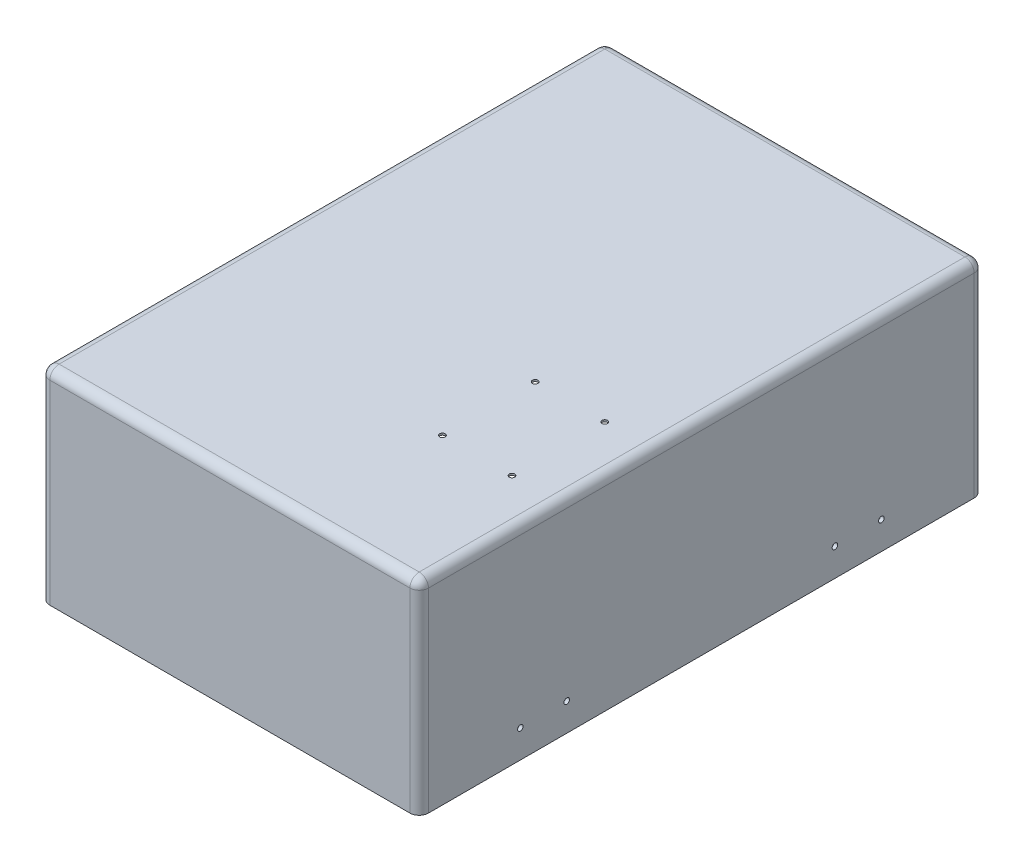
ISO-10303-21;
HEADER;
FILE_DESCRIPTION(('STEP AP214'),'2;1');
FILE_NAME('part.step','',(''),(''),'','','');
FILE_SCHEMA(('AUTOMOTIVE_DESIGN { 1 0 10303 214 1 1 1 1 }'));
ENDSEC;
DATA;
#1=APPLICATION_CONTEXT('core data for automotive mechanical design processes');
#2=APPLICATION_PROTOCOL_DEFINITION('international standard','automotive_design',2000,#1);
#3=PRODUCT_CONTEXT('',#1,'mechanical');
#4=PRODUCT('Part','Part','',(#3));
#5=PRODUCT_RELATED_PRODUCT_CATEGORY('part','',(#4));
#6=PRODUCT_DEFINITION_FORMATION('','',#4);
#7=PRODUCT_DEFINITION_CONTEXT('part definition',#1,'design');
#8=PRODUCT_DEFINITION('design','',#6,#7);
#9=PRODUCT_DEFINITION_SHAPE('','',#8);
#10=(LENGTH_UNIT() NAMED_UNIT(*) SI_UNIT(.MILLI.,.METRE.));
#11=(NAMED_UNIT(*) PLANE_ANGLE_UNIT() SI_UNIT($,.RADIAN.));
#12=(NAMED_UNIT(*) SI_UNIT($,.STERADIAN.) SOLID_ANGLE_UNIT());
#13=UNCERTAINTY_MEASURE_WITH_UNIT(LENGTH_MEASURE(1.E-05),#10,'distance_accuracy_value','');
#14=(GEOMETRIC_REPRESENTATION_CONTEXT(3) GLOBAL_UNCERTAINTY_ASSIGNED_CONTEXT((#13)) GLOBAL_UNIT_ASSIGNED_CONTEXT((#10,
#11,#12)) REPRESENTATION_CONTEXT('',''));
#15=CARTESIAN_POINT('',(0.,0.,0.));
#16=DIRECTION('',(0.,0.,1.));
#17=DIRECTION('',(1.,0.,0.));
#18=AXIS2_PLACEMENT_3D('',#15,#16,#17);
#19=CARTESIAN_POINT('',(189.227831447779,-190.,-144.));
#20=DIRECTION('',(1.,0.,0.));
#21=DIRECTION('',(0.,0.,-1.));
#22=AXIS2_PLACEMENT_3D('',#19,#20,#21);
#23=CYLINDRICAL_SURFACE('',#22,3.);
#24=CARTESIAN_POINT('',(204.,-190.,-144.));
#25=DIRECTION('',(-1.,0.,0.));
#26=DIRECTION('',(0.,-1.,0.));
#27=AXIS2_PLACEMENT_3D('',#24,#25,#26);
#28=CIRCLE('',#27,3.);
#29=CARTESIAN_POINT('',(204.,-193.,-144.));
#30=VERTEX_POINT('',#29);
#31=EDGE_CURVE('E347',#30,#30,#28,.T.);
#32=ORIENTED_EDGE('',*,*,#31,.F.);
#33=EDGE_LOOP('',(#32));
#34=FACE_BOUND('',#33,.T.);
#35=CARTESIAN_POINT('',(200.,-190.,-144.));
#36=DIRECTION('',(1.,0.,0.));
#37=DIRECTION('',(0.,0.,1.));
#38=AXIS2_PLACEMENT_3D('',#35,#36,#37);
#39=CIRCLE('',#38,3.);
#40=CARTESIAN_POINT('',(200.,-190.,-141.));
#41=VERTEX_POINT('',#40);
#42=EDGE_CURVE('E423',#41,#41,#39,.T.);
#43=ORIENTED_EDGE('',*,*,#42,.F.);
#44=EDGE_LOOP('',(#43));
#45=FACE_BOUND('',#44,.T.);
#46=ADVANCED_FACE('F17',(#34,#45),#23,.F.);
#47=CARTESIAN_POINT('',(191.59591611211,-190.,-194.));
#48=DIRECTION('',(1.,0.,0.));
#49=DIRECTION('',(0.,0.,-1.));
#50=AXIS2_PLACEMENT_3D('',#47,#48,#49);
#51=CYLINDRICAL_SURFACE('',#50,3.);
#52=CARTESIAN_POINT('',(204.,-190.,-194.));
#53=DIRECTION('',(-1.,0.,0.));
#54=DIRECTION('',(0.,-1.,0.));
#55=AXIS2_PLACEMENT_3D('',#52,#53,#54);
#56=CIRCLE('',#55,3.);
#57=CARTESIAN_POINT('',(204.,-193.,-194.));
#58=VERTEX_POINT('',#57);
#59=EDGE_CURVE('E352',#58,#58,#56,.T.);
#60=ORIENTED_EDGE('',*,*,#59,.F.);
#61=EDGE_LOOP('',(#60));
#62=FACE_BOUND('',#61,.T.);
#63=CARTESIAN_POINT('',(200.,-190.,-194.));
#64=DIRECTION('',(1.,0.,0.));
#65=DIRECTION('',(0.,0.,1.));
#66=AXIS2_PLACEMENT_3D('',#63,#64,#65);
#67=CIRCLE('',#66,3.);
#68=CARTESIAN_POINT('',(200.,-190.,-191.));
#69=VERTEX_POINT('',#68);
#70=EDGE_CURVE('E419',#69,#69,#67,.T.);
#71=ORIENTED_EDGE('',*,*,#70,.F.);
#72=EDGE_LOOP('',(#71));
#73=FACE_BOUND('',#72,.T.);
#74=ADVANCED_FACE('F651',(#62,#73),#51,.F.);
#75=CARTESIAN_POINT('',(195.513389522599,-190.,145.));
#76=DIRECTION('',(1.,0.,0.));
#77=DIRECTION('',(0.,0.,-1.));
#78=AXIS2_PLACEMENT_3D('',#75,#76,#77);
#79=CYLINDRICAL_SURFACE('',#78,3.);
#80=CARTESIAN_POINT('',(204.,-190.,145.));
#81=DIRECTION('',(-1.,0.,0.));
#82=DIRECTION('',(0.,-1.,0.));
#83=AXIS2_PLACEMENT_3D('',#80,#81,#82);
#84=CIRCLE('',#83,3.);
#85=CARTESIAN_POINT('',(204.,-193.,145.));
#86=VERTEX_POINT('',#85);
#87=EDGE_CURVE('E264',#86,#86,#84,.T.);
#88=ORIENTED_EDGE('',*,*,#87,.F.);
#89=EDGE_LOOP('',(#88));
#90=FACE_BOUND('',#89,.T.);
#91=CARTESIAN_POINT('',(200.,-190.,145.));
#92=DIRECTION('',(1.,0.,0.));
#93=DIRECTION('',(0.,0.,1.));
#94=AXIS2_PLACEMENT_3D('',#91,#92,#93);
#95=CIRCLE('',#94,3.);
#96=CARTESIAN_POINT('',(200.,-190.,148.));
#97=VERTEX_POINT('',#96);
#98=EDGE_CURVE('E422',#97,#97,#95,.T.);
#99=ORIENTED_EDGE('',*,*,#98,.F.);
#100=EDGE_LOOP('',(#99));
#101=FACE_BOUND('',#100,.T.);
#102=ADVANCED_FACE('F656',(#90,#101),#79,.F.);
#103=CARTESIAN_POINT('',(183.680573859258,-190.,195.));
#104=DIRECTION('',(1.,0.,0.));
#105=DIRECTION('',(0.,0.,-1.));
#106=AXIS2_PLACEMENT_3D('',#103,#104,#105);
#107=CYLINDRICAL_SURFACE('',#106,3.);
#108=CARTESIAN_POINT('',(204.,-190.,195.));
#109=DIRECTION('',(-1.,0.,0.));
#110=DIRECTION('',(0.,-1.,0.));
#111=AXIS2_PLACEMENT_3D('',#108,#109,#110);
#112=CIRCLE('',#111,3.);
#113=CARTESIAN_POINT('',(204.,-193.,195.));
#114=VERTEX_POINT('',#113);
#115=EDGE_CURVE('E259',#114,#114,#112,.T.);
#116=ORIENTED_EDGE('',*,*,#115,.F.);
#117=EDGE_LOOP('',(#116));
#118=FACE_BOUND('',#117,.T.);
#119=CARTESIAN_POINT('',(200.,-190.,195.));
#120=DIRECTION('',(1.,0.,0.));
#121=DIRECTION('',(0.,0.,1.));
#122=AXIS2_PLACEMENT_3D('',#119,#120,#121);
#123=CIRCLE('',#122,3.);
#124=CARTESIAN_POINT('',(200.,-190.,198.));
#125=VERTEX_POINT('',#124);
#126=EDGE_CURVE('E436',#125,#125,#123,.T.);
#127=ORIENTED_EDGE('',*,*,#126,.F.);
#128=EDGE_LOOP('',(#127));
#129=FACE_BOUND('',#128,.T.);
#130=ADVANCED_FACE('F691',(#118,#129),#107,.F.);
#131=CARTESIAN_POINT('',(79.,-3.90891219785888,154.));
#132=DIRECTION('',(0.,1.,0.));
#133=DIRECTION('',(0.,0.,1.));
#134=AXIS2_PLACEMENT_3D('',#131,#132,#133);
#135=CYLINDRICAL_SURFACE('',#134,3.);
#136=CARTESIAN_POINT('',(79.,0.,154.));
#137=DIRECTION('',(0.,-1.,0.));
#138=DIRECTION('',(-1.,0.,0.));
#139=AXIS2_PLACEMENT_3D('',#136,#137,#138);
#140=CIRCLE('',#139,3.);
#141=CARTESIAN_POINT('',(76.,0.,154.));
#142=VERTEX_POINT('',#141);
#143=EDGE_CURVE('E608',#142,#142,#140,.T.);
#144=ORIENTED_EDGE('',*,*,#143,.F.);
#145=EDGE_LOOP('',(#144));
#146=FACE_BOUND('',#145,.T.);
#147=CARTESIAN_POINT('',(79.,-2.,154.));
#148=DIRECTION('',(0.,1.,0.));
#149=DIRECTION('',(0.,0.,-1.));
#150=AXIS2_PLACEMENT_3D('',#147,#148,#149);
#151=CIRCLE('',#150,3.);
#152=CARTESIAN_POINT('',(79.,-2.,151.));
#153=VERTEX_POINT('',#152);
#154=EDGE_CURVE('E402',#153,#153,#151,.T.);
#155=ORIENTED_EDGE('',*,*,#154,.F.);
#156=EDGE_LOOP('',(#155));
#157=FACE_BOUND('',#156,.T.);
#158=ADVANCED_FACE('F688',(#146,#157),#135,.F.);
#159=CARTESIAN_POINT('',(154.,-4.68505447703618,154.));
#160=DIRECTION('',(0.,1.,0.));
#161=DIRECTION('',(0.,0.,1.));
#162=AXIS2_PLACEMENT_3D('',#159,#160,#161);
#163=CYLINDRICAL_SURFACE('',#162,3.);
#164=CARTESIAN_POINT('',(154.,0.,154.));
#165=DIRECTION('',(0.,-1.,0.));
#166=DIRECTION('',(-1.,0.,0.));
#167=AXIS2_PLACEMENT_3D('',#164,#165,#166);
#168=CIRCLE('',#167,3.);
#169=CARTESIAN_POINT('',(151.,0.,154.));
#170=VERTEX_POINT('',#169);
#171=EDGE_CURVE('E605',#170,#170,#168,.T.);
#172=ORIENTED_EDGE('',*,*,#171,.F.);
#173=EDGE_LOOP('',(#172));
#174=FACE_BOUND('',#173,.T.);
#175=CARTESIAN_POINT('',(154.,-2.,154.));
#176=DIRECTION('',(0.,1.,0.));
#177=DIRECTION('',(0.,0.,-1.));
#178=AXIS2_PLACEMENT_3D('',#175,#176,#177);
#179=CIRCLE('',#178,3.);
#180=CARTESIAN_POINT('',(154.,-2.,151.));
#181=VERTEX_POINT('',#180);
#182=EDGE_CURVE('E403',#181,#181,#179,.T.);
#183=ORIENTED_EDGE('',*,*,#182,.F.);
#184=EDGE_LOOP('',(#183));
#185=FACE_BOUND('',#184,.T.);
#186=ADVANCED_FACE('F632',(#174,#185),#163,.F.);
#187=CARTESIAN_POINT('',(154.,-4.69000260563148,54.));
#188=DIRECTION('',(0.,1.,0.));
#189=DIRECTION('',(0.,0.,1.));
#190=AXIS2_PLACEMENT_3D('',#187,#188,#189);
#191=CYLINDRICAL_SURFACE('',#190,3.);
#192=CARTESIAN_POINT('',(154.,0.,54.));
#193=DIRECTION('',(0.,-1.,0.));
#194=DIRECTION('',(-1.,0.,0.));
#195=AXIS2_PLACEMENT_3D('',#192,#193,#194);
#196=CIRCLE('',#195,3.);
#197=CARTESIAN_POINT('',(151.,0.,54.));
#198=VERTEX_POINT('',#197);
#199=EDGE_CURVE('E590',#198,#198,#196,.T.);
#200=ORIENTED_EDGE('',*,*,#199,.F.);
#201=EDGE_LOOP('',(#200));
#202=FACE_BOUND('',#201,.T.);
#203=CARTESIAN_POINT('',(154.,-2.,54.));
#204=DIRECTION('',(0.,1.,0.));
#205=DIRECTION('',(0.,0.,-1.));
#206=AXIS2_PLACEMENT_3D('',#203,#204,#205);
#207=CIRCLE('',#206,3.);
#208=CARTESIAN_POINT('',(154.,-2.,51.));
#209=VERTEX_POINT('',#208);
#210=EDGE_CURVE('E181',#209,#209,#207,.T.);
#211=ORIENTED_EDGE('',*,*,#210,.F.);
#212=EDGE_LOOP('',(#211));
#213=FACE_BOUND('',#212,.T.);
#214=ADVANCED_FACE('F628',(#202,#213),#191,.F.);
#215=CARTESIAN_POINT('',(79.,-19.9895739705716,54.));
#216=DIRECTION('',(0.,1.,0.));
#217=DIRECTION('',(0.,0.,1.));
#218=AXIS2_PLACEMENT_3D('',#215,#216,#217);
#219=CYLINDRICAL_SURFACE('',#218,3.);
#220=CARTESIAN_POINT('',(79.,0.,54.));
#221=DIRECTION('',(0.,-1.,0.));
#222=DIRECTION('',(-1.,0.,0.));
#223=AXIS2_PLACEMENT_3D('',#220,#221,#222);
#224=CIRCLE('',#223,3.);
#225=CARTESIAN_POINT('',(76.,0.,54.));
#226=VERTEX_POINT('',#225);
#227=EDGE_CURVE('E582',#226,#226,#224,.T.);
#228=ORIENTED_EDGE('',*,*,#227,.F.);
#229=EDGE_LOOP('',(#228));
#230=FACE_BOUND('',#229,.T.);
#231=CARTESIAN_POINT('',(79.,-2.,54.));
#232=DIRECTION('',(0.,1.,0.));
#233=DIRECTION('',(0.,0.,-1.));
#234=AXIS2_PLACEMENT_3D('',#231,#232,#233);
#235=CIRCLE('',#234,3.);
#236=CARTESIAN_POINT('',(79.,-2.,51.));
#237=VERTEX_POINT('',#236);
#238=EDGE_CURVE('E176',#237,#237,#235,.T.);
#239=ORIENTED_EDGE('',*,*,#238,.F.);
#240=EDGE_LOOP('',(#239));
#241=FACE_BOUND('',#240,.T.);
#242=ADVANCED_FACE('F631',(#230,#241),#219,.F.);
#243=CARTESIAN_POINT('',(-194.,-220.,294.));
#244=DIRECTION('',(0.,1.,0.));
#245=DIRECTION('',(0.,0.,1.));
#246=AXIS2_PLACEMENT_3D('',#243,#244,#245);
#247=CYLINDRICAL_SURFACE('',#246,10.);
#248=CARTESIAN_POINT('',(-194.,-220.,294.));
#249=DIRECTION('',(0.,-1.,0.));
#250=DIRECTION('',(0.,0.,-1.));
#251=AXIS2_PLACEMENT_3D('',#248,#249,#250);
#252=CIRCLE('',#251,10.);
#253=CARTESIAN_POINT('',(-194.,-220.,304.));
#254=VERTEX_POINT('',#253);
#255=CARTESIAN_POINT('',(-204.,-220.,294.));
#256=VERTEX_POINT('',#255);
#257=EDGE_CURVE('E361',#254,#256,#252,.T.);
#258=ORIENTED_EDGE('',*,*,#257,.F.);
#259=DIRECTION('',(0.,-1.,0.));
#260=VECTOR('',#259,1.);
#261=CARTESIAN_POINT('',(-194.,-220.,304.));
#262=LINE('',#261,#260);
#263=CARTESIAN_POINT('',(-194.,-10.,304.));
#264=VERTEX_POINT('',#263);
#265=EDGE_CURVE('E315',#264,#254,#262,.T.);
#266=ORIENTED_EDGE('',*,*,#265,.F.);
#267=CARTESIAN_POINT('',(-194.,-10.,294.));
#268=DIRECTION('',(0.,-1.,0.));
#269=DIRECTION('',(0.,0.,1.));
#270=AXIS2_PLACEMENT_3D('',#267,#268,#269);
#271=CIRCLE('',#270,10.);
#272=CARTESIAN_POINT('',(-204.,-10.,294.));
#273=VERTEX_POINT('',#272);
#274=EDGE_CURVE('E11',#264,#273,#271,.T.);
#275=ORIENTED_EDGE('',*,*,#274,.T.);
#276=DIRECTION('',(0.,1.,0.));
#277=VECTOR('',#276,1.);
#278=CARTESIAN_POINT('',(-204.,-220.,294.));
#279=LINE('',#278,#277);
#280=EDGE_CURVE('E306',#256,#273,#279,.T.);
#281=ORIENTED_EDGE('',*,*,#280,.F.);
#282=EDGE_LOOP('',(#258,#266,#275,#281));
#283=FACE_BOUND('',#282,.T.);
#284=ADVANCED_FACE('F547',(#283),#247,.T.);
#285=CARTESIAN_POINT('',(-194.,-10.,294.));
#286=DIRECTION('',(0.,1.,0.));
#287=DIRECTION('',(0.,0.,1.));
#288=AXIS2_PLACEMENT_3D('',#285,#286,#287);
#289=SPHERICAL_SURFACE('',#288,10.);
#290=CARTESIAN_POINT('',(-194.,-10.,294.));
#291=DIRECTION('',(-1.,0.,0.));
#292=DIRECTION('',(0.,0.,1.));
#293=AXIS2_PLACEMENT_3D('',#290,#291,#292);
#294=CIRCLE('',#293,10.);
#295=CARTESIAN_POINT('',(-194.,0.,294.));
#296=VERTEX_POINT('',#295);
#297=EDGE_CURVE('E26',#264,#296,#294,.T.);
#298=ORIENTED_EDGE('',*,*,#297,.T.);
#299=CARTESIAN_POINT('',(-194.,-10.,294.));
#300=DIRECTION('',(0.,0.,1.));
#301=DIRECTION('',(1.,0.,0.));
#302=AXIS2_PLACEMENT_3D('',#299,#300,#301);
#303=CIRCLE('',#302,10.);
#304=EDGE_CURVE('E222',#296,#273,#303,.T.);
#305=ORIENTED_EDGE('',*,*,#304,.T.);
#306=ORIENTED_EDGE('',*,*,#274,.F.);
#307=EDGE_LOOP('',(#298,#305,#306));
#308=FACE_BOUND('',#307,.T.);
#309=ADVANCED_FACE('F768',(#308),#289,.T.);
#310=CARTESIAN_POINT('',(204.,-10.,294.));
#311=DIRECTION('',(-1.,0.,0.));
#312=DIRECTION('',(0.,0.,1.));
#313=AXIS2_PLACEMENT_3D('',#310,#311,#312);
#314=CYLINDRICAL_SURFACE('',#313,10.);
#315=CARTESIAN_POINT('',(194.,-10.,294.));
#316=DIRECTION('',(-1.,0.,0.));
#317=DIRECTION('',(0.,0.,-1.));
#318=AXIS2_PLACEMENT_3D('',#315,#316,#317);
#319=CIRCLE('',#318,10.);
#320=CARTESIAN_POINT('',(194.,-10.,304.));
#321=VERTEX_POINT('',#320);
#322=CARTESIAN_POINT('',(194.,0.,294.));
#323=VERTEX_POINT('',#322);
#324=EDGE_CURVE('E219',#321,#323,#319,.T.);
#325=ORIENTED_EDGE('',*,*,#324,.T.);
#326=DIRECTION('',(1.,0.,0.));
#327=VECTOR('',#326,1.);
#328=CARTESIAN_POINT('',(0.,0.,294.));
#329=LINE('',#328,#327);
#330=EDGE_CURVE('E543',#296,#323,#329,.T.);
#331=ORIENTED_EDGE('',*,*,#330,.F.);
#332=ORIENTED_EDGE('',*,*,#297,.F.);
#333=DIRECTION('',(-1.,0.,0.));
#334=VECTOR('',#333,1.);
#335=CARTESIAN_POINT('',(204.,-10.,304.));
#336=LINE('',#335,#334);
#337=EDGE_CURVE('E305',#321,#264,#336,.T.);
#338=ORIENTED_EDGE('',*,*,#337,.F.);
#339=EDGE_LOOP('',(#325,#331,#332,#338));
#340=FACE_BOUND('',#339,.T.);
#341=ADVANCED_FACE('F540',(#340),#314,.T.);
#342=CARTESIAN_POINT('',(-194.,-10.,304.));
#343=DIRECTION('',(0.,0.,-1.));
#344=DIRECTION('',(-1.,0.,0.));
#345=AXIS2_PLACEMENT_3D('',#342,#343,#344);
#346=CYLINDRICAL_SURFACE('',#345,10.);
#347=CARTESIAN_POINT('',(-194.,-10.,-294.));
#348=DIRECTION('',(0.,0.,1.));
#349=DIRECTION('',(-1.,0.,0.));
#350=AXIS2_PLACEMENT_3D('',#347,#348,#349);
#351=CIRCLE('',#350,10.);
#352=CARTESIAN_POINT('',(-194.,0.,-294.));
#353=VERTEX_POINT('',#352);
#354=CARTESIAN_POINT('',(-204.,-10.,-294.));
#355=VERTEX_POINT('',#354);
#356=EDGE_CURVE('E223',#353,#355,#351,.T.);
#357=ORIENTED_EDGE('',*,*,#356,.T.);
#358=DIRECTION('',(0.,0.,-1.));
#359=VECTOR('',#358,1.);
#360=CARTESIAN_POINT('',(-204.,-10.,304.));
#361=LINE('',#360,#359);
#362=EDGE_CURVE('E310',#273,#355,#361,.T.);
#363=ORIENTED_EDGE('',*,*,#362,.F.);
#364=ORIENTED_EDGE('',*,*,#304,.F.);
#365=DIRECTION('',(0.,0.,1.));
#366=VECTOR('',#365,1.);
#367=CARTESIAN_POINT('',(-194.,0.,0.));
#368=LINE('',#367,#366);
#369=EDGE_CURVE('E577',#353,#296,#368,.T.);
#370=ORIENTED_EDGE('',*,*,#369,.F.);
#371=EDGE_LOOP('',(#357,#363,#364,#370));
#372=FACE_BOUND('',#371,.T.);
#373=ADVANCED_FACE('F777',(#372),#346,.T.);
#374=CARTESIAN_POINT('',(194.,-10.,294.));
#375=DIRECTION('',(1.,0.,0.));
#376=DIRECTION('',(0.,1.,0.));
#377=AXIS2_PLACEMENT_3D('',#374,#375,#376);
#378=SPHERICAL_SURFACE('',#377,10.);
#379=CARTESIAN_POINT('',(194.,-10.,294.));
#380=DIRECTION('',(0.,1.,0.));
#381=DIRECTION('',(0.,0.,1.));
#382=AXIS2_PLACEMENT_3D('',#379,#380,#381);
#383=CIRCLE('',#382,10.);
#384=CARTESIAN_POINT('',(204.,-10.,294.));
#385=VERTEX_POINT('',#384);
#386=EDGE_CURVE('E276',#321,#385,#383,.T.);
#387=ORIENTED_EDGE('',*,*,#386,.T.);
#388=CARTESIAN_POINT('',(194.,-10.,294.));
#389=DIRECTION('',(0.,0.,1.));
#390=DIRECTION('',(1.,0.,0.));
#391=AXIS2_PLACEMENT_3D('',#388,#389,#390);
#392=CIRCLE('',#391,10.);
#393=EDGE_CURVE('E254',#385,#323,#392,.T.);
#394=ORIENTED_EDGE('',*,*,#393,.T.);
#395=ORIENTED_EDGE('',*,*,#324,.F.);
#396=EDGE_LOOP('',(#387,#394,#395));
#397=FACE_BOUND('',#396,.T.);
#398=ADVANCED_FACE('F524',(#397),#378,.T.);
#399=CARTESIAN_POINT('',(-194.,-10.,-294.));
#400=DIRECTION('',(0.,0.,-1.));
#401=DIRECTION('',(0.,1.,0.));
#402=AXIS2_PLACEMENT_3D('',#399,#400,#401);
#403=SPHERICAL_SURFACE('',#402,10.);
#404=CARTESIAN_POINT('',(-194.,-10.,-294.));
#405=DIRECTION('',(-1.,0.,0.));
#406=DIRECTION('',(0.,0.,1.));
#407=AXIS2_PLACEMENT_3D('',#404,#405,#406);
#408=CIRCLE('',#407,10.);
#409=CARTESIAN_POINT('',(-194.,-10.,-304.));
#410=VERTEX_POINT('',#409);
#411=EDGE_CURVE('E251',#353,#410,#408,.T.);
#412=ORIENTED_EDGE('',*,*,#411,.T.);
#413=CARTESIAN_POINT('',(-194.,-10.,-294.));
#414=DIRECTION('',(0.,1.,0.));
#415=DIRECTION('',(0.,0.,1.));
#416=AXIS2_PLACEMENT_3D('',#413,#414,#415);
#417=CIRCLE('',#416,10.);
#418=EDGE_CURVE('E197',#410,#355,#417,.T.);
#419=ORIENTED_EDGE('',*,*,#418,.T.);
#420=ORIENTED_EDGE('',*,*,#356,.F.);
#421=EDGE_LOOP('',(#412,#419,#420));
#422=FACE_BOUND('',#421,.T.);
#423=ADVANCED_FACE('F783',(#422),#403,.T.);
#424=CARTESIAN_POINT('',(194.,-220.,294.));
#425=DIRECTION('',(0.,1.,0.));
#426=DIRECTION('',(0.,0.,1.));
#427=AXIS2_PLACEMENT_3D('',#424,#425,#426);
#428=CYLINDRICAL_SURFACE('',#427,10.);
#429=CARTESIAN_POINT('',(194.,-220.,294.));
#430=DIRECTION('',(0.,-1.,0.));
#431=DIRECTION('',(0.,0.,-1.));
#432=AXIS2_PLACEMENT_3D('',#429,#430,#431);
#433=CIRCLE('',#432,10.);
#434=CARTESIAN_POINT('',(204.,-220.,294.));
#435=VERTEX_POINT('',#434);
#436=CARTESIAN_POINT('',(194.,-220.,304.));
#437=VERTEX_POINT('',#436);
#438=EDGE_CURVE('E399',#435,#437,#433,.T.);
#439=ORIENTED_EDGE('',*,*,#438,.F.);
#440=DIRECTION('',(0.,-1.,0.));
#441=VECTOR('',#440,1.);
#442=CARTESIAN_POINT('',(204.,-220.,294.));
#443=LINE('',#442,#441);
#444=EDGE_CURVE('E369',#385,#435,#443,.T.);
#445=ORIENTED_EDGE('',*,*,#444,.F.);
#446=ORIENTED_EDGE('',*,*,#386,.F.);
#447=DIRECTION('',(0.,1.,0.));
#448=VECTOR('',#447,1.);
#449=CARTESIAN_POINT('',(194.,-220.,304.));
#450=LINE('',#449,#448);
#451=EDGE_CURVE('E326',#437,#321,#450,.T.);
#452=ORIENTED_EDGE('',*,*,#451,.F.);
#453=EDGE_LOOP('',(#439,#445,#446,#452));
#454=FACE_BOUND('',#453,.T.);
#455=ADVANCED_FACE('F534',(#454),#428,.T.);
#456=CARTESIAN_POINT('',(194.,-10.,-304.));
#457=DIRECTION('',(0.,0.,1.));
#458=DIRECTION('',(1.,0.,0.));
#459=AXIS2_PLACEMENT_3D('',#456,#457,#458);
#460=CYLINDRICAL_SURFACE('',#459,10.);
#461=CARTESIAN_POINT('',(194.,-10.,-294.));
#462=DIRECTION('',(0.,0.,1.));
#463=DIRECTION('',(-1.,0.,0.));
#464=AXIS2_PLACEMENT_3D('',#461,#462,#463);
#465=CIRCLE('',#464,10.);
#466=CARTESIAN_POINT('',(204.,-10.,-294.));
#467=VERTEX_POINT('',#466);
#468=CARTESIAN_POINT('',(194.,0.,-294.));
#469=VERTEX_POINT('',#468);
#470=EDGE_CURVE('E198',#467,#469,#465,.T.);
#471=ORIENTED_EDGE('',*,*,#470,.T.);
#472=DIRECTION('',(0.,0.,-1.));
#473=VECTOR('',#472,1.);
#474=CARTESIAN_POINT('',(194.,0.,0.));
#475=LINE('',#474,#473);
#476=EDGE_CURVE('E566',#323,#469,#475,.T.);
#477=ORIENTED_EDGE('',*,*,#476,.F.);
#478=ORIENTED_EDGE('',*,*,#393,.F.);
#479=DIRECTION('',(0.,0.,1.));
#480=VECTOR('',#479,1.);
#481=CARTESIAN_POINT('',(204.,-10.,-304.));
#482=LINE('',#481,#480);
#483=EDGE_CURVE('E263',#467,#385,#482,.T.);
#484=ORIENTED_EDGE('',*,*,#483,.F.);
#485=EDGE_LOOP('',(#471,#477,#478,#484));
#486=FACE_BOUND('',#485,.T.);
#487=ADVANCED_FACE('F562',(#486),#460,.T.);
#488=CARTESIAN_POINT('',(-204.,-10.,-294.));
#489=DIRECTION('',(1.,0.,0.));
#490=DIRECTION('',(0.,0.,-1.));
#491=AXIS2_PLACEMENT_3D('',#488,#489,#490);
#492=CYLINDRICAL_SURFACE('',#491,10.);
#493=CARTESIAN_POINT('',(194.,-10.,-294.));
#494=DIRECTION('',(-1.,0.,0.));
#495=DIRECTION('',(0.,0.,-1.));
#496=AXIS2_PLACEMENT_3D('',#493,#494,#495);
#497=CIRCLE('',#496,10.);
#498=CARTESIAN_POINT('',(194.,-10.,-304.));
#499=VERTEX_POINT('',#498);
#500=EDGE_CURVE('E194',#469,#499,#497,.T.);
#501=ORIENTED_EDGE('',*,*,#500,.T.);
#502=DIRECTION('',(1.,0.,0.));
#503=VECTOR('',#502,1.);
#504=CARTESIAN_POINT('',(-204.,-10.,-304.));
#505=LINE('',#504,#503);
#506=EDGE_CURVE('E277',#410,#499,#505,.T.);
#507=ORIENTED_EDGE('',*,*,#506,.F.);
#508=ORIENTED_EDGE('',*,*,#411,.F.);
#509=DIRECTION('',(-1.,0.,0.));
#510=VECTOR('',#509,1.);
#511=CARTESIAN_POINT('',(0.,0.,-294.));
#512=LINE('',#511,#510);
#513=EDGE_CURVE('E572',#469,#353,#512,.T.);
#514=ORIENTED_EDGE('',*,*,#513,.F.);
#515=EDGE_LOOP('',(#501,#507,#508,#514));
#516=FACE_BOUND('',#515,.T.);
#517=ADVANCED_FACE('F786',(#516),#492,.T.);
#518=CARTESIAN_POINT('',(-194.,-220.,-294.));
#519=DIRECTION('',(0.,1.,0.));
#520=DIRECTION('',(0.,0.,1.));
#521=AXIS2_PLACEMENT_3D('',#518,#519,#520);
#522=CYLINDRICAL_SURFACE('',#521,10.);
#523=CARTESIAN_POINT('',(-194.,-220.,-294.));
#524=DIRECTION('',(0.,-1.,0.));
#525=DIRECTION('',(0.,0.,-1.));
#526=AXIS2_PLACEMENT_3D('',#523,#524,#525);
#527=CIRCLE('',#526,10.);
#528=CARTESIAN_POINT('',(-204.,-220.,-294.));
#529=VERTEX_POINT('',#528);
#530=CARTESIAN_POINT('',(-194.,-220.,-304.));
#531=VERTEX_POINT('',#530);
#532=EDGE_CURVE('E364',#529,#531,#527,.T.);
#533=ORIENTED_EDGE('',*,*,#532,.F.);
#534=DIRECTION('',(0.,-1.,0.));
#535=VECTOR('',#534,1.);
#536=CARTESIAN_POINT('',(-204.,-220.,-294.));
#537=LINE('',#536,#535);
#538=EDGE_CURVE('E330',#355,#529,#537,.T.);
#539=ORIENTED_EDGE('',*,*,#538,.F.);
#540=ORIENTED_EDGE('',*,*,#418,.F.);
#541=DIRECTION('',(0.,1.,0.));
#542=VECTOR('',#541,1.);
#543=CARTESIAN_POINT('',(-194.,-220.,-304.));
#544=LINE('',#543,#542);
#545=EDGE_CURVE('E282',#531,#410,#544,.T.);
#546=ORIENTED_EDGE('',*,*,#545,.F.);
#547=EDGE_LOOP('',(#533,#539,#540,#546));
#548=FACE_BOUND('',#547,.T.);
#549=ADVANCED_FACE('F789',(#548),#522,.T.);
#550=CARTESIAN_POINT('',(194.,-10.,-294.));
#551=DIRECTION('',(0.,0.,-1.));
#552=DIRECTION('',(0.,1.,0.));
#553=AXIS2_PLACEMENT_3D('',#550,#551,#552);
#554=SPHERICAL_SURFACE('',#553,10.);
#555=ORIENTED_EDGE('',*,*,#470,.F.);
#556=CARTESIAN_POINT('',(194.,-10.,-294.));
#557=DIRECTION('',(0.,1.,0.));
#558=DIRECTION('',(0.,0.,1.));
#559=AXIS2_PLACEMENT_3D('',#556,#557,#558);
#560=CIRCLE('',#559,10.);
#561=EDGE_CURVE('E184',#467,#499,#560,.T.);
#562=ORIENTED_EDGE('',*,*,#561,.T.);
#563=ORIENTED_EDGE('',*,*,#500,.F.);
#564=EDGE_LOOP('',(#555,#562,#563));
#565=FACE_BOUND('',#564,.T.);
#566=ADVANCED_FACE('F759',(#565),#554,.T.);
#567=CARTESIAN_POINT('',(194.,-220.,-294.));
#568=DIRECTION('',(0.,1.,0.));
#569=DIRECTION('',(0.,0.,1.));
#570=AXIS2_PLACEMENT_3D('',#567,#568,#569);
#571=CYLINDRICAL_SURFACE('',#570,10.);
#572=ORIENTED_EDGE('',*,*,#561,.F.);
#573=DIRECTION('',(0.,1.,0.));
#574=VECTOR('',#573,1.);
#575=CARTESIAN_POINT('',(204.,-220.,-294.));
#576=LINE('',#575,#574);
#577=CARTESIAN_POINT('',(204.,-220.,-294.));
#578=VERTEX_POINT('',#577);
#579=EDGE_CURVE('E358',#578,#467,#576,.T.);
#580=ORIENTED_EDGE('',*,*,#579,.F.);
#581=CARTESIAN_POINT('',(194.,-220.,-294.));
#582=DIRECTION('',(0.,-1.,0.));
#583=DIRECTION('',(0.,0.,-1.));
#584=AXIS2_PLACEMENT_3D('',#581,#582,#583);
#585=CIRCLE('',#584,10.);
#586=CARTESIAN_POINT('',(194.,-220.,-304.));
#587=VERTEX_POINT('',#586);
#588=EDGE_CURVE('E396',#587,#578,#585,.T.);
#589=ORIENTED_EDGE('',*,*,#588,.F.);
#590=DIRECTION('',(0.,-1.,0.));
#591=VECTOR('',#590,1.);
#592=CARTESIAN_POINT('',(194.,-220.,-304.));
#593=LINE('',#592,#591);
#594=EDGE_CURVE('E281',#499,#587,#593,.T.);
#595=ORIENTED_EDGE('',*,*,#594,.F.);
#596=EDGE_LOOP('',(#572,#580,#589,#595));
#597=FACE_BOUND('',#596,.T.);
#598=ADVANCED_FACE('F755',(#597),#571,.T.);
#599=CARTESIAN_POINT('',(190.,-220.,-290.));
#600=DIRECTION('',(0.,-1.,0.));
#601=DIRECTION('',(0.,0.,-1.));
#602=AXIS2_PLACEMENT_3D('',#599,#600,#601);
#603=CYLINDRICAL_SURFACE('',#602,10.);
#604=CARTESIAN_POINT('',(190.,-220.,-290.));
#605=DIRECTION('',(0.,1.,0.));
#606=DIRECTION('',(0.,0.,-1.));
#607=AXIS2_PLACEMENT_3D('',#604,#605,#606);
#608=CIRCLE('',#607,10.);
#609=CARTESIAN_POINT('',(200.,-220.,-290.));
#610=VERTEX_POINT('',#609);
#611=CARTESIAN_POINT('',(190.,-220.,-300.));
#612=VERTEX_POINT('',#611);
#613=EDGE_CURVE('E365',#610,#612,#608,.T.);
#614=ORIENTED_EDGE('',*,*,#613,.F.);
#615=DIRECTION('',(0.,-1.,0.));
#616=VECTOR('',#615,1.);
#617=CARTESIAN_POINT('',(200.,-220.,-290.));
#618=LINE('',#617,#616);
#619=CARTESIAN_POINT('',(200.,-12.,-290.));
#620=VERTEX_POINT('',#619);
#621=EDGE_CURVE('E424',#620,#610,#618,.T.);
#622=ORIENTED_EDGE('',*,*,#621,.F.);
#623=CARTESIAN_POINT('',(190.,-12.,-290.));
#624=DIRECTION('',(0.,1.,0.));
#625=DIRECTION('',(0.,0.,-1.));
#626=AXIS2_PLACEMENT_3D('',#623,#624,#625);
#627=CIRCLE('',#626,10.);
#628=CARTESIAN_POINT('',(190.,-12.,-300.));
#629=VERTEX_POINT('',#628);
#630=EDGE_CURVE('E141',#620,#629,#627,.T.);
#631=ORIENTED_EDGE('',*,*,#630,.T.);
#632=DIRECTION('',(0.,1.,0.));
#633=VECTOR('',#632,1.);
#634=CARTESIAN_POINT('',(190.,-2.,-300.));
#635=LINE('',#634,#633);
#636=EDGE_CURVE('E298',#612,#629,#635,.T.);
#637=ORIENTED_EDGE('',*,*,#636,.F.);
#638=EDGE_LOOP('',(#614,#622,#631,#637));
#639=FACE_BOUND('',#638,.T.);
#640=ADVANCED_FACE('F758',(#639),#603,.F.);
#641=CARTESIAN_POINT('',(190.,-12.,-290.));
#642=DIRECTION('',(0.,1.,0.));
#643=DIRECTION('',(0.,0.,1.));
#644=AXIS2_PLACEMENT_3D('',#641,#642,#643);
#645=SPHERICAL_SURFACE('',#644,10.);
#646=CARTESIAN_POINT('',(190.,-12.,-290.));
#647=DIRECTION('',(0.,0.,1.));
#648=DIRECTION('',(1.,0.,0.));
#649=AXIS2_PLACEMENT_3D('',#646,#647,#648);
#650=CIRCLE('',#649,10.);
#651=CARTESIAN_POINT('',(190.,-2.,-290.));
#652=VERTEX_POINT('',#651);
#653=EDGE_CURVE('E133',#620,#652,#650,.T.);
#654=ORIENTED_EDGE('',*,*,#653,.T.);
#655=CARTESIAN_POINT('',(190.,-12.,-290.));
#656=DIRECTION('',(-1.,0.,0.));
#657=DIRECTION('',(0.,0.,1.));
#658=AXIS2_PLACEMENT_3D('',#655,#656,#657);
#659=CIRCLE('',#658,10.);
#660=EDGE_CURVE('E137',#652,#629,#659,.T.);
#661=ORIENTED_EDGE('',*,*,#660,.T.);
#662=ORIENTED_EDGE('',*,*,#630,.F.);
#663=EDGE_LOOP('',(#654,#661,#662));
#664=FACE_BOUND('',#663,.T.);
#665=ADVANCED_FACE('F135',(#664),#645,.F.);
#666=CARTESIAN_POINT('',(190.,-12.,0.));
#667=DIRECTION('',(0.,0.,-1.));
#668=DIRECTION('',(-1.,0.,0.));
#669=AXIS2_PLACEMENT_3D('',#666,#667,#668);
#670=CYLINDRICAL_SURFACE('',#669,10.);
#671=CARTESIAN_POINT('',(190.,-12.,290.));
#672=DIRECTION('',(0.,0.,1.));
#673=DIRECTION('',(-1.,0.,0.));
#674=AXIS2_PLACEMENT_3D('',#671,#672,#673);
#675=CIRCLE('',#674,10.);
#676=CARTESIAN_POINT('',(200.,-12.,290.));
#677=VERTEX_POINT('',#676);
#678=CARTESIAN_POINT('',(190.,-2.,290.));
#679=VERTEX_POINT('',#678);
#680=EDGE_CURVE('E158',#677,#679,#675,.T.);
#681=ORIENTED_EDGE('',*,*,#680,.T.);
#682=DIRECTION('',(0.,0.,1.));
#683=VECTOR('',#682,1.);
#684=CARTESIAN_POINT('',(190.,-2.,300.));
#685=LINE('',#684,#683);
#686=EDGE_CURVE('E161',#652,#679,#685,.T.);
#687=ORIENTED_EDGE('',*,*,#686,.F.);
#688=ORIENTED_EDGE('',*,*,#653,.F.);
#689=DIRECTION('',(0.,0.,-1.));
#690=VECTOR('',#689,1.);
#691=CARTESIAN_POINT('',(200.,-12.,-300.));
#692=LINE('',#691,#690);
#693=EDGE_CURVE('E429',#677,#620,#692,.T.);
#694=ORIENTED_EDGE('',*,*,#693,.F.);
#695=EDGE_LOOP('',(#681,#687,#688,#694));
#696=FACE_BOUND('',#695,.T.);
#697=ADVANCED_FACE('F162',(#696),#670,.F.);
#698=CARTESIAN_POINT('',(0.,-12.,-290.));
#699=DIRECTION('',(-1.,0.,0.));
#700=DIRECTION('',(0.,0.,1.));
#701=AXIS2_PLACEMENT_3D('',#698,#699,#700);
#702=CYLINDRICAL_SURFACE('',#701,10.);
#703=CARTESIAN_POINT('',(-190.,-12.,-290.));
#704=DIRECTION('',(-1.,0.,0.));
#705=DIRECTION('',(0.,0.,-1.));
#706=AXIS2_PLACEMENT_3D('',#703,#704,#705);
#707=CIRCLE('',#706,10.);
#708=CARTESIAN_POINT('',(-190.,-2.,-290.));
#709=VERTEX_POINT('',#708);
#710=CARTESIAN_POINT('',(-190.,-12.,-300.));
#711=VERTEX_POINT('',#710);
#712=EDGE_CURVE('E210',#709,#711,#707,.T.);
#713=ORIENTED_EDGE('',*,*,#712,.T.);
#714=DIRECTION('',(-1.,0.,0.));
#715=VECTOR('',#714,1.);
#716=CARTESIAN_POINT('',(-200.,-12.,-300.));
#717=LINE('',#716,#715);
#718=EDGE_CURVE('E155',#629,#711,#717,.T.);
#719=ORIENTED_EDGE('',*,*,#718,.F.);
#720=ORIENTED_EDGE('',*,*,#660,.F.);
#721=DIRECTION('',(1.,0.,0.));
#722=VECTOR('',#721,1.);
#723=CARTESIAN_POINT('',(200.,-2.,-290.));
#724=LINE('',#723,#722);
#725=EDGE_CURVE('E153',#709,#652,#724,.T.);
#726=ORIENTED_EDGE('',*,*,#725,.F.);
#727=EDGE_LOOP('',(#713,#719,#720,#726));
#728=FACE_BOUND('',#727,.T.);
#729=ADVANCED_FACE('F151',(#728),#702,.F.);
#730=CARTESIAN_POINT('',(190.,-12.,290.));
#731=DIRECTION('',(0.,0.,1.));
#732=DIRECTION('',(1.,0.,0.));
#733=AXIS2_PLACEMENT_3D('',#730,#731,#732);
#734=SPHERICAL_SURFACE('',#733,10.);
#735=CARTESIAN_POINT('',(190.,-12.,290.));
#736=DIRECTION('',(0.,-1.,0.));
#737=DIRECTION('',(0.,0.,-1.));
#738=AXIS2_PLACEMENT_3D('',#735,#736,#737);
#739=CIRCLE('',#738,10.);
#740=CARTESIAN_POINT('',(190.,-12.,300.));
#741=VERTEX_POINT('',#740);
#742=EDGE_CURVE('E206',#677,#741,#739,.T.);
#743=ORIENTED_EDGE('',*,*,#742,.T.);
#744=CARTESIAN_POINT('',(190.,-12.,290.));
#745=DIRECTION('',(-1.,0.,0.));
#746=DIRECTION('',(0.,0.,1.));
#747=AXIS2_PLACEMENT_3D('',#744,#745,#746);
#748=CIRCLE('',#747,10.);
#749=EDGE_CURVE('E211',#741,#679,#748,.T.);
#750=ORIENTED_EDGE('',*,*,#749,.T.);
#751=ORIENTED_EDGE('',*,*,#680,.F.);
#752=EDGE_LOOP('',(#743,#750,#751));
#753=FACE_BOUND('',#752,.T.);
#754=ADVANCED_FACE('F808',(#753),#734,.F.);
#755=CARTESIAN_POINT('',(-190.,-12.,-290.));
#756=DIRECTION('',(-1.,0.,0.));
#757=DIRECTION('',(0.,0.,1.));
#758=AXIS2_PLACEMENT_3D('',#755,#756,#757);
#759=SPHERICAL_SURFACE('',#758,10.);
#760=CARTESIAN_POINT('',(-190.,-12.,-290.));
#761=DIRECTION('',(0.,0.,1.));
#762=DIRECTION('',(1.,0.,0.));
#763=AXIS2_PLACEMENT_3D('',#760,#761,#762);
#764=CIRCLE('',#763,10.);
#765=CARTESIAN_POINT('',(-200.,-12.,-290.));
#766=VERTEX_POINT('',#765);
#767=EDGE_CURVE('E205',#709,#766,#764,.T.);
#768=ORIENTED_EDGE('',*,*,#767,.T.);
#769=CARTESIAN_POINT('',(-190.,-12.,-290.));
#770=DIRECTION('',(0.,-1.,0.));
#771=DIRECTION('',(0.,0.,-1.));
#772=AXIS2_PLACEMENT_3D('',#769,#770,#771);
#773=CIRCLE('',#772,10.);
#774=EDGE_CURVE('E201',#766,#711,#773,.T.);
#775=ORIENTED_EDGE('',*,*,#774,.T.);
#776=ORIENTED_EDGE('',*,*,#712,.F.);
#777=EDGE_LOOP('',(#768,#775,#776));
#778=FACE_BOUND('',#777,.T.);
#779=ADVANCED_FACE('F814',(#778),#759,.F.);
#780=CARTESIAN_POINT('',(190.,-220.,290.));
#781=DIRECTION('',(0.,-1.,0.));
#782=DIRECTION('',(0.,0.,-1.));
#783=AXIS2_PLACEMENT_3D('',#780,#781,#782);
#784=CYLINDRICAL_SURFACE('',#783,10.);
#785=CARTESIAN_POINT('',(190.,-220.,290.));
#786=DIRECTION('',(0.,1.,0.));
#787=DIRECTION('',(0.,0.,-1.));
#788=AXIS2_PLACEMENT_3D('',#785,#786,#787);
#789=CIRCLE('',#788,10.);
#790=CARTESIAN_POINT('',(190.,-220.,300.));
#791=VERTEX_POINT('',#790);
#792=CARTESIAN_POINT('',(200.,-220.,290.));
#793=VERTEX_POINT('',#792);
#794=EDGE_CURVE('E385',#791,#793,#789,.T.);
#795=ORIENTED_EDGE('',*,*,#794,.F.);
#796=DIRECTION('',(0.,-1.,0.));
#797=VECTOR('',#796,1.);
#798=CARTESIAN_POINT('',(190.,-220.,300.));
#799=LINE('',#798,#797);
#800=EDGE_CURVE('E246',#741,#791,#799,.T.);
#801=ORIENTED_EDGE('',*,*,#800,.F.);
#802=ORIENTED_EDGE('',*,*,#742,.F.);
#803=DIRECTION('',(0.,1.,0.));
#804=VECTOR('',#803,1.);
#805=CARTESIAN_POINT('',(200.,-2.,290.));
#806=LINE('',#805,#804);
#807=EDGE_CURVE('E241',#793,#677,#806,.T.);
#808=ORIENTED_EDGE('',*,*,#807,.F.);
#809=EDGE_LOOP('',(#795,#801,#802,#808));
#810=FACE_BOUND('',#809,.T.);
#811=ADVANCED_FACE('F460',(#810),#784,.F.);
#812=CARTESIAN_POINT('',(0.,-12.,290.));
#813=DIRECTION('',(1.,0.,0.));
#814=DIRECTION('',(0.,0.,-1.));
#815=AXIS2_PLACEMENT_3D('',#812,#813,#814);
#816=CYLINDRICAL_SURFACE('',#815,10.);
#817=CARTESIAN_POINT('',(-190.,-12.,290.));
#818=DIRECTION('',(-1.,0.,0.));
#819=DIRECTION('',(0.,0.,-1.));
#820=AXIS2_PLACEMENT_3D('',#817,#818,#819);
#821=CIRCLE('',#820,10.);
#822=CARTESIAN_POINT('',(-190.,-12.,300.));
#823=VERTEX_POINT('',#822);
#824=CARTESIAN_POINT('',(-190.,-2.,290.));
#825=VERTEX_POINT('',#824);
#826=EDGE_CURVE('E193',#823,#825,#821,.T.);
#827=ORIENTED_EDGE('',*,*,#826,.T.);
#828=DIRECTION('',(-1.,0.,0.));
#829=VECTOR('',#828,1.);
#830=CARTESIAN_POINT('',(-200.,-2.,290.));
#831=LINE('',#830,#829);
#832=EDGE_CURVE('E168',#679,#825,#831,.T.);
#833=ORIENTED_EDGE('',*,*,#832,.F.);
#834=ORIENTED_EDGE('',*,*,#749,.F.);
#835=DIRECTION('',(1.,0.,0.));
#836=VECTOR('',#835,1.);
#837=CARTESIAN_POINT('',(200.,-12.,300.));
#838=LINE('',#837,#836);
#839=EDGE_CURVE('E243',#823,#741,#838,.T.);
#840=ORIENTED_EDGE('',*,*,#839,.F.);
#841=EDGE_LOOP('',(#827,#833,#834,#840));
#842=FACE_BOUND('',#841,.T.);
#843=ADVANCED_FACE('F737',(#842),#816,.F.);
#844=CARTESIAN_POINT('',(-190.,-12.,0.));
#845=DIRECTION('',(0.,0.,1.));
#846=DIRECTION('',(1.,0.,0.));
#847=AXIS2_PLACEMENT_3D('',#844,#845,#846);
#848=CYLINDRICAL_SURFACE('',#847,10.);
#849=CARTESIAN_POINT('',(-190.,-12.,290.));
#850=DIRECTION('',(0.,0.,1.));
#851=DIRECTION('',(-1.,0.,0.));
#852=AXIS2_PLACEMENT_3D('',#849,#850,#851);
#853=CIRCLE('',#852,10.);
#854=CARTESIAN_POINT('',(-200.,-12.,290.));
#855=VERTEX_POINT('',#854);
#856=EDGE_CURVE('E38',#825,#855,#853,.T.);
#857=ORIENTED_EDGE('',*,*,#856,.T.);
#858=DIRECTION('',(0.,0.,1.));
#859=VECTOR('',#858,1.);
#860=CARTESIAN_POINT('',(-200.,-12.,300.));
#861=LINE('',#860,#859);
#862=EDGE_CURVE('E286',#766,#855,#861,.T.);
#863=ORIENTED_EDGE('',*,*,#862,.F.);
#864=ORIENTED_EDGE('',*,*,#767,.F.);
#865=DIRECTION('',(0.,0.,-1.));
#866=VECTOR('',#865,1.);
#867=CARTESIAN_POINT('',(-190.,-2.,-300.));
#868=LINE('',#867,#866);
#869=EDGE_CURVE('E174',#825,#709,#868,.T.);
#870=ORIENTED_EDGE('',*,*,#869,.F.);
#871=EDGE_LOOP('',(#857,#863,#864,#870));
#872=FACE_BOUND('',#871,.T.);
#873=ADVANCED_FACE('F734',(#872),#848,.F.);
#874=CARTESIAN_POINT('',(-190.,-220.,-290.));
#875=DIRECTION('',(0.,-1.,0.));
#876=DIRECTION('',(0.,0.,-1.));
#877=AXIS2_PLACEMENT_3D('',#874,#875,#876);
#878=CYLINDRICAL_SURFACE('',#877,10.);
#879=CARTESIAN_POINT('',(-190.,-220.,-290.));
#880=DIRECTION('',(0.,1.,0.));
#881=DIRECTION('',(0.,0.,-1.));
#882=AXIS2_PLACEMENT_3D('',#879,#880,#881);
#883=CIRCLE('',#882,10.);
#884=CARTESIAN_POINT('',(-190.,-220.,-300.));
#885=VERTEX_POINT('',#884);
#886=CARTESIAN_POINT('',(-200.,-220.,-290.));
#887=VERTEX_POINT('',#886);
#888=EDGE_CURVE('E353',#885,#887,#883,.T.);
#889=ORIENTED_EDGE('',*,*,#888,.F.);
#890=DIRECTION('',(0.,-1.,0.));
#891=VECTOR('',#890,1.);
#892=CARTESIAN_POINT('',(-190.,-220.,-300.));
#893=LINE('',#892,#891);
#894=EDGE_CURVE('E301',#711,#885,#893,.T.);
#895=ORIENTED_EDGE('',*,*,#894,.F.);
#896=ORIENTED_EDGE('',*,*,#774,.F.);
#897=DIRECTION('',(0.,1.,0.));
#898=VECTOR('',#897,1.);
#899=CARTESIAN_POINT('',(-200.,-2.,-290.));
#900=LINE('',#899,#898);
#901=EDGE_CURVE('E272',#887,#766,#900,.T.);
#902=ORIENTED_EDGE('',*,*,#901,.F.);
#903=EDGE_LOOP('',(#889,#895,#896,#902));
#904=FACE_BOUND('',#903,.T.);
#905=ADVANCED_FACE('F729',(#904),#878,.F.);
#906=CARTESIAN_POINT('',(-190.,-12.,290.));
#907=DIRECTION('',(-1.,0.,0.));
#908=DIRECTION('',(0.,0.,1.));
#909=AXIS2_PLACEMENT_3D('',#906,#907,#908);
#910=SPHERICAL_SURFACE('',#909,10.);
#911=ORIENTED_EDGE('',*,*,#826,.F.);
#912=CARTESIAN_POINT('',(-190.,-12.,290.));
#913=DIRECTION('',(0.,-1.,0.));
#914=DIRECTION('',(0.,0.,-1.));
#915=AXIS2_PLACEMENT_3D('',#912,#913,#914);
#916=CIRCLE('',#915,10.);
#917=EDGE_CURVE('E190',#823,#855,#916,.T.);
#918=ORIENTED_EDGE('',*,*,#917,.T.);
#919=ORIENTED_EDGE('',*,*,#856,.F.);
#920=EDGE_LOOP('',(#911,#918,#919));
#921=FACE_BOUND('',#920,.T.);
#922=ADVANCED_FACE('F647',(#921),#910,.F.);
#923=CARTESIAN_POINT('',(-190.,-220.,290.));
#924=DIRECTION('',(0.,-1.,0.));
#925=DIRECTION('',(0.,0.,-1.));
#926=AXIS2_PLACEMENT_3D('',#923,#924,#925);
#927=CYLINDRICAL_SURFACE('',#926,10.);
#928=ORIENTED_EDGE('',*,*,#917,.F.);
#929=DIRECTION('',(0.,1.,0.));
#930=VECTOR('',#929,1.);
#931=CARTESIAN_POINT('',(-190.,-2.,300.));
#932=LINE('',#931,#930);
#933=CARTESIAN_POINT('',(-190.,-220.,300.));
#934=VERTEX_POINT('',#933);
#935=EDGE_CURVE('E258',#934,#823,#932,.T.);
#936=ORIENTED_EDGE('',*,*,#935,.F.);
#937=CARTESIAN_POINT('',(-190.,-220.,290.));
#938=DIRECTION('',(0.,1.,0.));
#939=DIRECTION('',(0.,0.,-1.));
#940=AXIS2_PLACEMENT_3D('',#937,#938,#939);
#941=CIRCLE('',#940,10.);
#942=CARTESIAN_POINT('',(-200.,-220.,290.));
#943=VERTEX_POINT('',#942);
#944=EDGE_CURVE('E357',#943,#934,#941,.T.);
#945=ORIENTED_EDGE('',*,*,#944,.F.);
#946=DIRECTION('',(0.,-1.,0.));
#947=VECTOR('',#946,1.);
#948=CARTESIAN_POINT('',(-200.,-220.,290.));
#949=LINE('',#948,#947);
#950=EDGE_CURVE('E290',#855,#943,#949,.T.);
#951=ORIENTED_EDGE('',*,*,#950,.F.);
#952=EDGE_LOOP('',(#928,#936,#945,#951));
#953=FACE_BOUND('',#952,.T.);
#954=ADVANCED_FACE('F639',(#953),#927,.F.);
#955=CARTESIAN_POINT('',(0.,-2.,0.));
#956=DIRECTION('',(0.,-1.,0.));
#957=DIRECTION('',(0.,0.,-1.));
#958=AXIS2_PLACEMENT_3D('',#955,#956,#957);
#959=PLANE('',#958);
#960=ORIENTED_EDGE('',*,*,#725,.T.);
#961=ORIENTED_EDGE('',*,*,#686,.T.);
#962=ORIENTED_EDGE('',*,*,#832,.T.);
#963=ORIENTED_EDGE('',*,*,#869,.T.);
#964=EDGE_LOOP('',(#960,#961,#962,#963));
#965=FACE_BOUND('',#964,.T.);
#966=ORIENTED_EDGE('',*,*,#238,.T.);
#967=EDGE_LOOP('',(#966));
#968=FACE_BOUND('',#967,.T.);
#969=ORIENTED_EDGE('',*,*,#210,.T.);
#970=EDGE_LOOP('',(#969));
#971=FACE_BOUND('',#970,.T.);
#972=ORIENTED_EDGE('',*,*,#182,.T.);
#973=EDGE_LOOP('',(#972));
#974=FACE_BOUND('',#973,.T.);
#975=ORIENTED_EDGE('',*,*,#154,.T.);
#976=EDGE_LOOP('',(#975));
#977=FACE_BOUND('',#976,.T.);
#978=ADVANCED_FACE('F171',(#965,#968,#971,#974,#977),#959,.T.);
#979=CARTESIAN_POINT('',(0.,-220.,0.));
#980=DIRECTION('',(0.,-1.,0.));
#981=DIRECTION('',(0.,0.,-1.));
#982=AXIS2_PLACEMENT_3D('',#979,#980,#981);
#983=PLANE('',#982);
#984=DIRECTION('',(-1.,0.,0.));
#985=VECTOR('',#984,1.);
#986=CARTESIAN_POINT('',(204.,-220.,304.));
#987=LINE('',#986,#985);
#988=EDGE_CURVE('E322',#437,#254,#987,.T.);
#989=ORIENTED_EDGE('',*,*,#988,.T.);
#990=ORIENTED_EDGE('',*,*,#257,.T.);
#991=DIRECTION('',(0.,0.,-1.));
#992=VECTOR('',#991,1.);
#993=CARTESIAN_POINT('',(-204.,-220.,304.));
#994=LINE('',#993,#992);
#995=EDGE_CURVE('E311',#256,#529,#994,.T.);
#996=ORIENTED_EDGE('',*,*,#995,.T.);
#997=ORIENTED_EDGE('',*,*,#532,.T.);
#998=DIRECTION('',(1.,0.,0.));
#999=VECTOR('',#998,1.);
#1000=CARTESIAN_POINT('',(-204.,-220.,-304.));
#1001=LINE('',#1000,#999);
#1002=EDGE_CURVE('E334',#531,#587,#1001,.T.);
#1003=ORIENTED_EDGE('',*,*,#1002,.T.);
#1004=ORIENTED_EDGE('',*,*,#588,.T.);
#1005=DIRECTION('',(0.,0.,1.));
#1006=VECTOR('',#1005,1.);
#1007=CARTESIAN_POINT('',(204.,-220.,-304.));
#1008=LINE('',#1007,#1006);
#1009=EDGE_CURVE('E373',#578,#435,#1008,.T.);
#1010=ORIENTED_EDGE('',*,*,#1009,.T.);
#1011=ORIENTED_EDGE('',*,*,#438,.T.);
#1012=EDGE_LOOP('',(#989,#990,#996,#997,#1003,#1004,#1010,#1011));
#1013=FACE_BOUND('',#1012,.T.);
#1014=DIRECTION('',(1.,0.,0.));
#1015=VECTOR('',#1014,1.);
#1016=CARTESIAN_POINT('',(-200.,-220.,-300.));
#1017=LINE('',#1016,#1015);
#1018=EDGE_CURVE('E294',#885,#612,#1017,.T.);
#1019=ORIENTED_EDGE('',*,*,#1018,.F.);
#1020=ORIENTED_EDGE('',*,*,#888,.T.);
#1021=DIRECTION('',(0.,0.,-1.));
#1022=VECTOR('',#1021,1.);
#1023=CARTESIAN_POINT('',(-200.,-220.,300.));
#1024=LINE('',#1023,#1022);
#1025=EDGE_CURVE('E268',#943,#887,#1024,.T.);
#1026=ORIENTED_EDGE('',*,*,#1025,.F.);
#1027=ORIENTED_EDGE('',*,*,#944,.T.);
#1028=DIRECTION('',(-1.,0.,0.));
#1029=VECTOR('',#1028,1.);
#1030=CARTESIAN_POINT('',(200.,-220.,300.));
#1031=LINE('',#1030,#1029);
#1032=EDGE_CURVE('E250',#791,#934,#1031,.T.);
#1033=ORIENTED_EDGE('',*,*,#1032,.F.);
#1034=ORIENTED_EDGE('',*,*,#794,.T.);
#1035=DIRECTION('',(0.,0.,1.));
#1036=VECTOR('',#1035,1.);
#1037=CARTESIAN_POINT('',(200.,-220.,-300.));
#1038=LINE('',#1037,#1036);
#1039=EDGE_CURVE('E428',#610,#793,#1038,.T.);
#1040=ORIENTED_EDGE('',*,*,#1039,.F.);
#1041=ORIENTED_EDGE('',*,*,#613,.T.);
#1042=EDGE_LOOP('',(#1019,#1020,#1026,#1027,#1033,#1034,#1040,#1041));
#1043=FACE_BOUND('',#1042,.T.);
#1044=ADVANCED_FACE('F554',(#1013,#1043),#983,.T.);
#1045=CARTESIAN_POINT('',(204.,-220.,-304.));
#1046=DIRECTION('',(-1.,0.,0.));
#1047=DIRECTION('',(0.,0.,1.));
#1048=AXIS2_PLACEMENT_3D('',#1045,#1046,#1047);
#1049=PLANE('',#1048);
#1050=ORIENTED_EDGE('',*,*,#483,.T.);
#1051=ORIENTED_EDGE('',*,*,#444,.T.);
#1052=ORIENTED_EDGE('',*,*,#1009,.F.);
#1053=ORIENTED_EDGE('',*,*,#579,.T.);
#1054=EDGE_LOOP('',(#1050,#1051,#1052,#1053));
#1055=FACE_BOUND('',#1054,.T.);
#1056=ORIENTED_EDGE('',*,*,#115,.T.);
#1057=EDGE_LOOP('',(#1056));
#1058=FACE_BOUND('',#1057,.T.);
#1059=ORIENTED_EDGE('',*,*,#87,.T.);
#1060=EDGE_LOOP('',(#1059));
#1061=FACE_BOUND('',#1060,.T.);
#1062=ORIENTED_EDGE('',*,*,#59,.T.);
#1063=EDGE_LOOP('',(#1062));
#1064=FACE_BOUND('',#1063,.T.);
#1065=ORIENTED_EDGE('',*,*,#31,.T.);
#1066=EDGE_LOOP('',(#1065));
#1067=FACE_BOUND('',#1066,.T.);
#1068=ADVANCED_FACE('F558',(#1055,#1058,#1061,#1064,#1067),#1049,.F.);
#1069=CARTESIAN_POINT('',(-204.,-220.,-304.));
#1070=DIRECTION('',(0.,0.,1.));
#1071=DIRECTION('',(1.,0.,0.));
#1072=AXIS2_PLACEMENT_3D('',#1069,#1070,#1071);
#1073=PLANE('',#1072);
#1074=ORIENTED_EDGE('',*,*,#1002,.F.);
#1075=ORIENTED_EDGE('',*,*,#545,.T.);
#1076=ORIENTED_EDGE('',*,*,#506,.T.);
#1077=ORIENTED_EDGE('',*,*,#594,.T.);
#1078=EDGE_LOOP('',(#1074,#1075,#1076,#1077));
#1079=FACE_BOUND('',#1078,.T.);
#1080=ADVANCED_FACE('F750',(#1079),#1073,.F.);
#1081=CARTESIAN_POINT('',(-204.,-220.,304.));
#1082=DIRECTION('',(1.,0.,0.));
#1083=DIRECTION('',(0.,1.,0.));
#1084=AXIS2_PLACEMENT_3D('',#1081,#1082,#1083);
#1085=PLANE('',#1084);
#1086=ORIENTED_EDGE('',*,*,#995,.F.);
#1087=ORIENTED_EDGE('',*,*,#280,.T.);
#1088=ORIENTED_EDGE('',*,*,#362,.T.);
#1089=ORIENTED_EDGE('',*,*,#538,.T.);
#1090=EDGE_LOOP('',(#1086,#1087,#1088,#1089));
#1091=FACE_BOUND('',#1090,.T.);
#1092=ADVANCED_FACE('F744',(#1091),#1085,.F.);
#1093=CARTESIAN_POINT('',(204.,-220.,304.));
#1094=DIRECTION('',(0.,0.,-1.));
#1095=DIRECTION('',(0.,-1.,0.));
#1096=AXIS2_PLACEMENT_3D('',#1093,#1094,#1095);
#1097=PLANE('',#1096);
#1098=ORIENTED_EDGE('',*,*,#337,.T.);
#1099=ORIENTED_EDGE('',*,*,#265,.T.);
#1100=ORIENTED_EDGE('',*,*,#988,.F.);
#1101=ORIENTED_EDGE('',*,*,#451,.T.);
#1102=EDGE_LOOP('',(#1098,#1099,#1100,#1101));
#1103=FACE_BOUND('',#1102,.T.);
#1104=ADVANCED_FACE('F539',(#1103),#1097,.F.);
#1105=CARTESIAN_POINT('',(-200.,-220.,-300.));
#1106=DIRECTION('',(0.,0.,1.));
#1107=DIRECTION('',(1.,0.,0.));
#1108=AXIS2_PLACEMENT_3D('',#1105,#1106,#1107);
#1109=PLANE('',#1108);
#1110=ORIENTED_EDGE('',*,*,#1018,.T.);
#1111=ORIENTED_EDGE('',*,*,#636,.T.);
#1112=ORIENTED_EDGE('',*,*,#718,.T.);
#1113=ORIENTED_EDGE('',*,*,#894,.T.);
#1114=EDGE_LOOP('',(#1110,#1111,#1112,#1113));
#1115=FACE_BOUND('',#1114,.T.);
#1116=ADVANCED_FACE('F732',(#1115),#1109,.T.);
#1117=CARTESIAN_POINT('',(-200.,-220.,300.));
#1118=DIRECTION('',(1.,0.,0.));
#1119=DIRECTION('',(0.,1.,0.));
#1120=AXIS2_PLACEMENT_3D('',#1117,#1118,#1119);
#1121=PLANE('',#1120);
#1122=ORIENTED_EDGE('',*,*,#1025,.T.);
#1123=ORIENTED_EDGE('',*,*,#901,.T.);
#1124=ORIENTED_EDGE('',*,*,#862,.T.);
#1125=ORIENTED_EDGE('',*,*,#950,.T.);
#1126=EDGE_LOOP('',(#1122,#1123,#1124,#1125));
#1127=FACE_BOUND('',#1126,.T.);
#1128=ADVANCED_FACE('F722',(#1127),#1121,.T.);
#1129=CARTESIAN_POINT('',(200.,-220.,300.));
#1130=DIRECTION('',(0.,0.,-1.));
#1131=DIRECTION('',(0.,-1.,0.));
#1132=AXIS2_PLACEMENT_3D('',#1129,#1130,#1131);
#1133=PLANE('',#1132);
#1134=ORIENTED_EDGE('',*,*,#839,.T.);
#1135=ORIENTED_EDGE('',*,*,#800,.T.);
#1136=ORIENTED_EDGE('',*,*,#1032,.T.);
#1137=ORIENTED_EDGE('',*,*,#935,.T.);
#1138=EDGE_LOOP('',(#1134,#1135,#1136,#1137));
#1139=FACE_BOUND('',#1138,.T.);
#1140=ADVANCED_FACE('F713',(#1139),#1133,.T.);
#1141=CARTESIAN_POINT('',(200.,-220.,-300.));
#1142=DIRECTION('',(-1.,0.,0.));
#1143=DIRECTION('',(0.,0.,1.));
#1144=AXIS2_PLACEMENT_3D('',#1141,#1142,#1143);
#1145=PLANE('',#1144);
#1146=ORIENTED_EDGE('',*,*,#693,.T.);
#1147=ORIENTED_EDGE('',*,*,#621,.T.);
#1148=ORIENTED_EDGE('',*,*,#1039,.T.);
#1149=ORIENTED_EDGE('',*,*,#807,.T.);
#1150=EDGE_LOOP('',(#1146,#1147,#1148,#1149));
#1151=FACE_BOUND('',#1150,.T.);
#1152=ORIENTED_EDGE('',*,*,#126,.T.);
#1153=EDGE_LOOP('',(#1152));
#1154=FACE_BOUND('',#1153,.T.);
#1155=ORIENTED_EDGE('',*,*,#98,.T.);
#1156=EDGE_LOOP('',(#1155));
#1157=FACE_BOUND('',#1156,.T.);
#1158=ORIENTED_EDGE('',*,*,#70,.T.);
#1159=EDGE_LOOP('',(#1158));
#1160=FACE_BOUND('',#1159,.T.);
#1161=ORIENTED_EDGE('',*,*,#42,.T.);
#1162=EDGE_LOOP('',(#1161));
#1163=FACE_BOUND('',#1162,.T.);
#1164=ADVANCED_FACE('F452',(#1151,#1154,#1157,#1160,#1163),#1145,.T.);
#1165=CARTESIAN_POINT('',(0.,0.,0.));
#1166=DIRECTION('',(0.,-1.,0.));
#1167=DIRECTION('',(0.,0.,-1.));
#1168=AXIS2_PLACEMENT_3D('',#1165,#1166,#1167);
#1169=PLANE('',#1168);
#1170=ORIENTED_EDGE('',*,*,#369,.T.);
#1171=ORIENTED_EDGE('',*,*,#330,.T.);
#1172=ORIENTED_EDGE('',*,*,#476,.T.);
#1173=ORIENTED_EDGE('',*,*,#513,.T.);
#1174=EDGE_LOOP('',(#1170,#1171,#1172,#1173));
#1175=FACE_BOUND('',#1174,.T.);
#1176=ORIENTED_EDGE('',*,*,#227,.T.);
#1177=EDGE_LOOP('',(#1176));
#1178=FACE_BOUND('',#1177,.T.);
#1179=ORIENTED_EDGE('',*,*,#199,.T.);
#1180=EDGE_LOOP('',(#1179));
#1181=FACE_BOUND('',#1180,.T.);
#1182=ORIENTED_EDGE('',*,*,#171,.T.);
#1183=EDGE_LOOP('',(#1182));
#1184=FACE_BOUND('',#1183,.T.);
#1185=ORIENTED_EDGE('',*,*,#143,.T.);
#1186=EDGE_LOOP('',(#1185));
#1187=FACE_BOUND('',#1186,.T.);
#1188=ADVANCED_FACE('F574',(#1175,#1178,#1181,#1184,#1187),#1169,.F.);
#1189=CLOSED_SHELL('',(#46,#74,#102,#130,#158,#186,#214,#242,#284,#309,#341,#373,#398,#423,#455,
#487,#517,#549,#566,#598,#640,#665,#697,#729,#754,#779,#811,#843,#873,#905,#922,#954,#978,#1044,
#1068,#1080,#1092,#1104,#1116,#1128,#1140,#1164,#1188));
#1190=MANIFOLD_SOLID_BREP('B1',#1189);
#1191=ADVANCED_BREP_SHAPE_REPRESENTATION('',(#18,#1190),#14);
#1192=SHAPE_DEFINITION_REPRESENTATION(#9,#1191);
ENDSEC;
END-ISO-10303-21;
